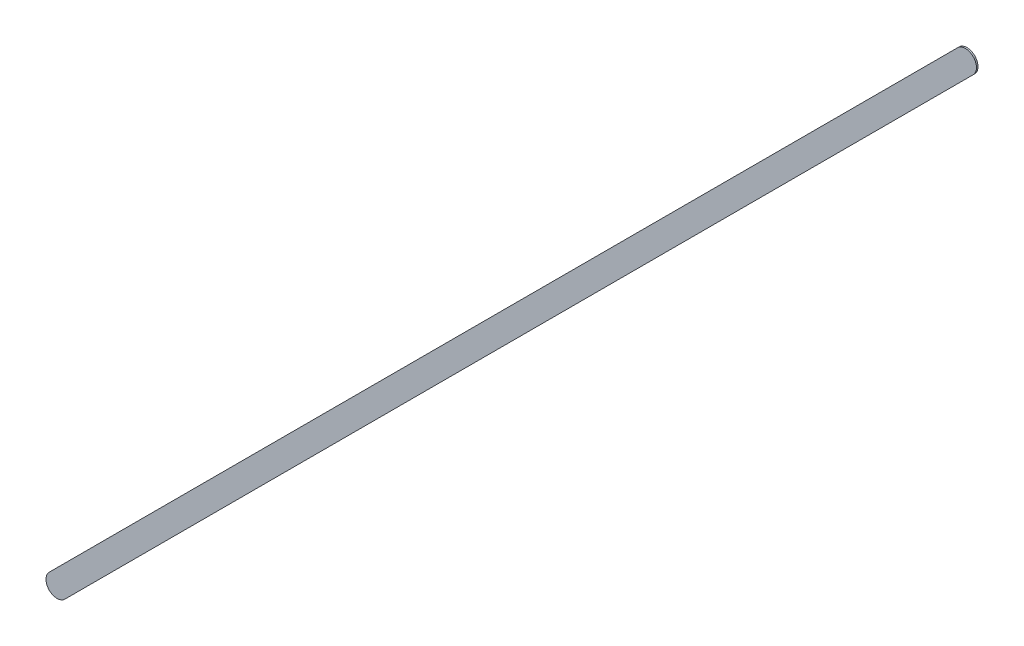
ISO-10303-21;
HEADER;
FILE_DESCRIPTION(('STEP AP214'),'2;1');
FILE_NAME('part.step','',(''),(''),'','','');
FILE_SCHEMA(('AUTOMOTIVE_DESIGN { 1 0 10303 214 1 1 1 1 }'));
ENDSEC;
DATA;
#1=APPLICATION_CONTEXT('core data for automotive mechanical design processes');
#2=APPLICATION_PROTOCOL_DEFINITION('international standard','automotive_design',2000,#1);
#3=PRODUCT_CONTEXT('',#1,'mechanical');
#4=PRODUCT('Part','Part','',(#3));
#5=PRODUCT_RELATED_PRODUCT_CATEGORY('part','',(#4));
#6=PRODUCT_DEFINITION_FORMATION('','',#4);
#7=PRODUCT_DEFINITION_CONTEXT('part definition',#1,'design');
#8=PRODUCT_DEFINITION('design','',#6,#7);
#9=PRODUCT_DEFINITION_SHAPE('','',#8);
#10=(LENGTH_UNIT() NAMED_UNIT(*) SI_UNIT(.MILLI.,.METRE.));
#11=(NAMED_UNIT(*) PLANE_ANGLE_UNIT() SI_UNIT($,.RADIAN.));
#12=(NAMED_UNIT(*) SI_UNIT($,.STERADIAN.) SOLID_ANGLE_UNIT());
#13=UNCERTAINTY_MEASURE_WITH_UNIT(LENGTH_MEASURE(1.E-05),#10,'distance_accuracy_value','');
#14=(GEOMETRIC_REPRESENTATION_CONTEXT(3) GLOBAL_UNCERTAINTY_ASSIGNED_CONTEXT((#13)) GLOBAL_UNIT_ASSIGNED_CONTEXT((#10,
#11,#12)) REPRESENTATION_CONTEXT('',''));
#15=CARTESIAN_POINT('',(0.,0.,0.));
#16=DIRECTION('',(0.,0.,1.));
#17=DIRECTION('',(1.,0.,0.));
#18=AXIS2_PLACEMENT_3D('',#15,#16,#17);
#19=CARTESIAN_POINT('',(57.85815708,92.73723388,0.));
#20=DIRECTION('',(-0.707106781186548,0.707106781186548,0.));
#21=DIRECTION('',(0.707106781186548,0.707106781186548,0.));
#22=AXIS2_PLACEMENT_3D('',#19,#20,#21);
#23=PLANE('',#22);
#24=DIRECTION('',(0.707106781186548,0.707106781186548,0.));
#25=VECTOR('',#24,1.);
#26=CARTESIAN_POINT('',(57.85815708,92.73723388,0.03556));
#27=LINE('',#26,#25);
#28=CARTESIAN_POINT('',(57.85815708,92.73723388,0.03556));
#29=VERTEX_POINT('',#28);
#30=CARTESIAN_POINT('',(78.44414588,113.32322268,0.03556));
#31=VERTEX_POINT('',#30);
#32=EDGE_CURVE('E11',#29,#31,#27,.T.);
#33=ORIENTED_EDGE('',*,*,#32,.F.);
#34=DIRECTION('',(0.,0.,1.));
#35=VECTOR('',#34,1.);
#36=CARTESIAN_POINT('',(57.85815708,92.73723388,0.));
#37=LINE('',#36,#35);
#38=CARTESIAN_POINT('',(57.85815708,92.73723388,0.));
#39=VERTEX_POINT('',#38);
#40=EDGE_CURVE('E24',#39,#29,#37,.T.);
#41=ORIENTED_EDGE('',*,*,#40,.F.);
#42=DIRECTION('',(0.707106781186548,0.707106781186548,0.));
#43=VECTOR('',#42,1.);
#44=CARTESIAN_POINT('',(57.85815708,92.73723388,0.));
#45=LINE('',#44,#43);
#46=CARTESIAN_POINT('',(78.44414588,113.32322268,0.));
#47=VERTEX_POINT('',#46);
#48=EDGE_CURVE('E75',#39,#47,#45,.T.);
#49=ORIENTED_EDGE('',*,*,#48,.T.);
#50=DIRECTION('',(0.,0.,1.));
#51=VECTOR('',#50,1.);
#52=CARTESIAN_POINT('',(78.44414588,113.32322268,0.));
#53=LINE('',#52,#51);
#54=EDGE_CURVE('E37',#47,#31,#53,.T.);
#55=ORIENTED_EDGE('',*,*,#54,.T.);
#56=EDGE_LOOP('',(#33,#41,#49,#55));
#57=FACE_BOUND('',#56,.T.);
#58=ADVANCED_FACE('F17',(#57),#23,.F.);
#59=CARTESIAN_POINT('',(78.2673695,113.49999906,0.));
#60=DIRECTION('',(0.,0.,-1.));
#61=DIRECTION('',(0.707106781186576,-0.707106781186519,0.));
#62=AXIS2_PLACEMENT_3D('',#59,#60,#61);
#63=CYLINDRICAL_SURFACE('',#62,0.249999554103226);
#64=CARTESIAN_POINT('',(78.2673695,113.49999906,0.03556));
#65=DIRECTION('',(0.,0.,1.));
#66=DIRECTION('',(0.707106781186576,-0.707106781186519,0.));
#67=AXIS2_PLACEMENT_3D('',#64,#65,#66);
#68=CIRCLE('',#67,0.249999554103226);
#69=CARTESIAN_POINT('',(78.09059312,113.67677544,0.03556));
#70=VERTEX_POINT('',#69);
#71=EDGE_CURVE('E83',#31,#70,#68,.T.);
#72=ORIENTED_EDGE('',*,*,#71,.F.);
#73=ORIENTED_EDGE('',*,*,#54,.F.);
#74=CARTESIAN_POINT('',(78.2673695,113.49999906,0.));
#75=DIRECTION('',(0.,0.,1.));
#76=DIRECTION('',(0.707106781186576,-0.707106781186519,0.));
#77=AXIS2_PLACEMENT_3D('',#74,#75,#76);
#78=CIRCLE('',#77,0.249999554103226);
#79=CARTESIAN_POINT('',(78.09059312,113.67677544,0.));
#80=VERTEX_POINT('',#79);
#81=EDGE_CURVE('E81',#47,#80,#78,.T.);
#82=ORIENTED_EDGE('',*,*,#81,.T.);
#83=DIRECTION('',(0.,0.,1.));
#84=VECTOR('',#83,1.);
#85=CARTESIAN_POINT('',(78.09059312,113.67677544,0.));
#86=LINE('',#85,#84);
#87=EDGE_CURVE('E67',#80,#70,#86,.T.);
#88=ORIENTED_EDGE('',*,*,#87,.T.);
#89=EDGE_LOOP('',(#72,#73,#82,#88));
#90=FACE_BOUND('',#89,.T.);
#91=ADVANCED_FACE('F89',(#90),#63,.T.);
#92=CARTESIAN_POINT('',(78.09059312,113.67677544,0.));
#93=DIRECTION('',(0.707106781186548,-0.707106781186547,0.));
#94=DIRECTION('',(-0.707106781186547,-0.707106781186548,0.));
#95=AXIS2_PLACEMENT_3D('',#92,#93,#94);
#96=PLANE('',#95);
#97=DIRECTION('',(-0.707106781186547,-0.707106781186548,0.));
#98=VECTOR('',#97,1.);
#99=CARTESIAN_POINT('',(78.09059312,113.67677544,0.03556));
#100=LINE('',#99,#98);
#101=CARTESIAN_POINT('',(57.50460432,93.09078664,0.03556));
#102=VERTEX_POINT('',#101);
#103=EDGE_CURVE('E71',#70,#102,#100,.T.);
#104=ORIENTED_EDGE('',*,*,#103,.F.);
#105=ORIENTED_EDGE('',*,*,#87,.F.);
#106=DIRECTION('',(-0.707106781186547,-0.707106781186548,0.));
#107=VECTOR('',#106,1.);
#108=CARTESIAN_POINT('',(78.09059312,113.67677544,0.));
#109=LINE('',#108,#107);
#110=CARTESIAN_POINT('',(57.50460432,93.09078664,0.));
#111=VERTEX_POINT('',#110);
#112=EDGE_CURVE('E63',#80,#111,#109,.T.);
#113=ORIENTED_EDGE('',*,*,#112,.T.);
#114=DIRECTION('',(0.,0.,1.));
#115=VECTOR('',#114,1.);
#116=CARTESIAN_POINT('',(57.50460432,93.09078664,0.));
#117=LINE('',#116,#115);
#118=EDGE_CURVE('E53',#111,#102,#117,.T.);
#119=ORIENTED_EDGE('',*,*,#118,.T.);
#120=EDGE_LOOP('',(#104,#105,#113,#119));
#121=FACE_BOUND('',#120,.T.);
#122=ADVANCED_FACE('F66',(#121),#96,.F.);
#123=CARTESIAN_POINT('',(57.6813807,92.91401026,0.));
#124=DIRECTION('',(0.,0.,-1.));
#125=DIRECTION('',(-0.707106781186562,0.707106781186533,0.));
#126=AXIS2_PLACEMENT_3D('',#123,#124,#125);
#127=CYLINDRICAL_SURFACE('',#126,0.249999554103221);
#128=CARTESIAN_POINT('',(57.6813807,92.91401026,0.03556));
#129=DIRECTION('',(0.,0.,1.));
#130=DIRECTION('',(-0.707106781186562,0.707106781186533,0.));
#131=AXIS2_PLACEMENT_3D('',#128,#129,#130);
#132=CIRCLE('',#131,0.249999554103221);
#133=EDGE_CURVE('E59',#102,#29,#132,.T.);
#134=ORIENTED_EDGE('',*,*,#133,.F.);
#135=ORIENTED_EDGE('',*,*,#118,.F.);
#136=CARTESIAN_POINT('',(57.6813807,92.91401026,0.));
#137=DIRECTION('',(0.,0.,1.));
#138=DIRECTION('',(-0.707106781186562,0.707106781186533,0.));
#139=AXIS2_PLACEMENT_3D('',#136,#137,#138);
#140=CIRCLE('',#139,0.249999554103221);
#141=EDGE_CURVE('E57',#111,#39,#140,.T.);
#142=ORIENTED_EDGE('',*,*,#141,.T.);
#143=ORIENTED_EDGE('',*,*,#40,.T.);
#144=EDGE_LOOP('',(#134,#135,#142,#143));
#145=FACE_BOUND('',#144,.T.);
#146=ADVANCED_FACE('F55',(#145),#127,.T.);
#147=CARTESIAN_POINT('',(57.85815708,92.73723388,0.));
#148=DIRECTION('',(0.,0.,-1.));
#149=DIRECTION('',(-1.,0.,0.));
#150=AXIS2_PLACEMENT_3D('',#147,#148,#149);
#151=PLANE('',#150);
#152=ORIENTED_EDGE('',*,*,#141,.F.);
#153=ORIENTED_EDGE('',*,*,#112,.F.);
#154=ORIENTED_EDGE('',*,*,#81,.F.);
#155=ORIENTED_EDGE('',*,*,#48,.F.);
#156=EDGE_LOOP('',(#152,#153,#154,#155));
#157=FACE_BOUND('',#156,.T.);
#158=ADVANCED_FACE('F74',(#157),#151,.T.);
#159=CARTESIAN_POINT('',(57.85815708,92.73723388,0.03556));
#160=DIRECTION('',(0.,0.,-1.));
#161=DIRECTION('',(-1.,0.,0.));
#162=AXIS2_PLACEMENT_3D('',#159,#160,#161);
#163=PLANE('',#162);
#164=ORIENTED_EDGE('',*,*,#32,.T.);
#165=ORIENTED_EDGE('',*,*,#71,.T.);
#166=ORIENTED_EDGE('',*,*,#103,.T.);
#167=ORIENTED_EDGE('',*,*,#133,.T.);
#168=EDGE_LOOP('',(#164,#165,#166,#167));
#169=FACE_BOUND('',#168,.T.);
#170=ADVANCED_FACE('F91',(#169),#163,.F.);
#171=CLOSED_SHELL('',(#58,#91,#122,#146,#158,#170));
#172=MANIFOLD_SOLID_BREP('B1',#171);
#173=ADVANCED_BREP_SHAPE_REPRESENTATION('',(#18,#172),#14);
#174=SHAPE_DEFINITION_REPRESENTATION(#9,#173);
ENDSEC;
END-ISO-10303-21;
